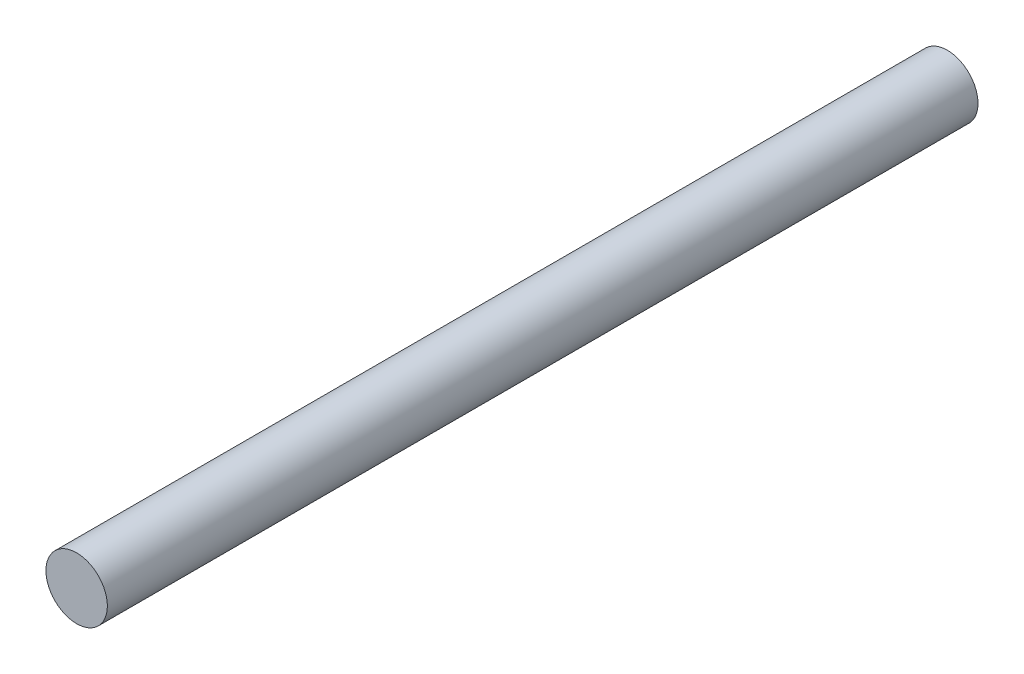
ISO-10303-21;
HEADER;
FILE_DESCRIPTION(('STEP AP214'),'2;1');
FILE_NAME('part.step','',(''),(''),'','','');
FILE_SCHEMA(('AUTOMOTIVE_DESIGN { 1 0 10303 214 1 1 1 1 }'));
ENDSEC;
DATA;
#1=APPLICATION_CONTEXT('core data for automotive mechanical design processes');
#2=APPLICATION_PROTOCOL_DEFINITION('international standard','automotive_design',2000,#1);
#3=PRODUCT_CONTEXT('',#1,'mechanical');
#4=PRODUCT('Part','Part','',(#3));
#5=PRODUCT_RELATED_PRODUCT_CATEGORY('part','',(#4));
#6=PRODUCT_DEFINITION_FORMATION('','',#4);
#7=PRODUCT_DEFINITION_CONTEXT('part definition',#1,'design');
#8=PRODUCT_DEFINITION('design','',#6,#7);
#9=PRODUCT_DEFINITION_SHAPE('','',#8);
#10=(LENGTH_UNIT() NAMED_UNIT(*) SI_UNIT(.MILLI.,.METRE.));
#11=(NAMED_UNIT(*) PLANE_ANGLE_UNIT() SI_UNIT($,.RADIAN.));
#12=(NAMED_UNIT(*) SI_UNIT($,.STERADIAN.) SOLID_ANGLE_UNIT());
#13=UNCERTAINTY_MEASURE_WITH_UNIT(LENGTH_MEASURE(1.E-05),#10,'distance_accuracy_value','');
#14=(GEOMETRIC_REPRESENTATION_CONTEXT(3) GLOBAL_UNCERTAINTY_ASSIGNED_CONTEXT((#13)) GLOBAL_UNIT_ASSIGNED_CONTEXT((#10,
#11,#12)) REPRESENTATION_CONTEXT('',''));
#15=CARTESIAN_POINT('',(0.,0.,0.));
#16=DIRECTION('',(0.,0.,1.));
#17=DIRECTION('',(1.,0.,0.));
#18=AXIS2_PLACEMENT_3D('',#15,#16,#17);
#19=CARTESIAN_POINT('',(0.,0.,415.));
#20=DIRECTION('',(0.,0.,-1.));
#21=DIRECTION('',(-1.,0.,0.));
#22=AXIS2_PLACEMENT_3D('',#19,#20,#21);
#23=CYLINDRICAL_SURFACE('',#22,14.64);
#24=CARTESIAN_POINT('',(0.,0.,415.));
#25=DIRECTION('',(0.,0.,1.));
#26=DIRECTION('',(1.,0.,0.));
#27=AXIS2_PLACEMENT_3D('',#24,#25,#26);
#28=CIRCLE('',#27,14.64);
#29=CARTESIAN_POINT('',(14.64,0.,415.));
#30=VERTEX_POINT('',#29);
#31=EDGE_CURVE('E12',#30,#30,#28,.T.);
#32=ORIENTED_EDGE('',*,*,#31,.F.);
#33=EDGE_LOOP('',(#32));
#34=FACE_BOUND('',#33,.T.);
#35=CARTESIAN_POINT('',(0.,0.,0.));
#36=DIRECTION('',(0.,0.,1.));
#37=DIRECTION('',(1.,0.,0.));
#38=AXIS2_PLACEMENT_3D('',#35,#36,#37);
#39=CIRCLE('',#38,14.64);
#40=CARTESIAN_POINT('',(14.64,0.,0.));
#41=VERTEX_POINT('',#40);
#42=EDGE_CURVE('E45',#41,#41,#39,.T.);
#43=ORIENTED_EDGE('',*,*,#42,.T.);
#44=EDGE_LOOP('',(#43));
#45=FACE_BOUND('',#44,.T.);
#46=ADVANCED_FACE('F42',(#34,#45),#23,.T.);
#47=CARTESIAN_POINT('',(0.,0.,415.));
#48=DIRECTION('',(0.,0.,1.));
#49=DIRECTION('',(1.,0.,0.));
#50=AXIS2_PLACEMENT_3D('',#47,#48,#49);
#51=PLANE('',#50);
#52=ORIENTED_EDGE('',*,*,#31,.T.);
#53=EDGE_LOOP('',(#52));
#54=FACE_BOUND('',#53,.T.);
#55=ADVANCED_FACE('F60',(#54),#51,.T.);
#56=CARTESIAN_POINT('',(0.,0.,0.));
#57=DIRECTION('',(0.,0.,1.));
#58=DIRECTION('',(1.,0.,0.));
#59=AXIS2_PLACEMENT_3D('',#56,#57,#58);
#60=PLANE('',#59);
#61=ORIENTED_EDGE('',*,*,#42,.F.);
#62=EDGE_LOOP('',(#61));
#63=FACE_BOUND('',#62,.T.);
#64=ADVANCED_FACE('F58',(#63),#60,.F.);
#65=CLOSED_SHELL('',(#46,#55,#64));
#66=MANIFOLD_SOLID_BREP('B2',#65);
#67=ADVANCED_BREP_SHAPE_REPRESENTATION('',(#18,#66),#14);
#68=SHAPE_DEFINITION_REPRESENTATION(#9,#67);
ENDSEC;
END-ISO-10303-21;
